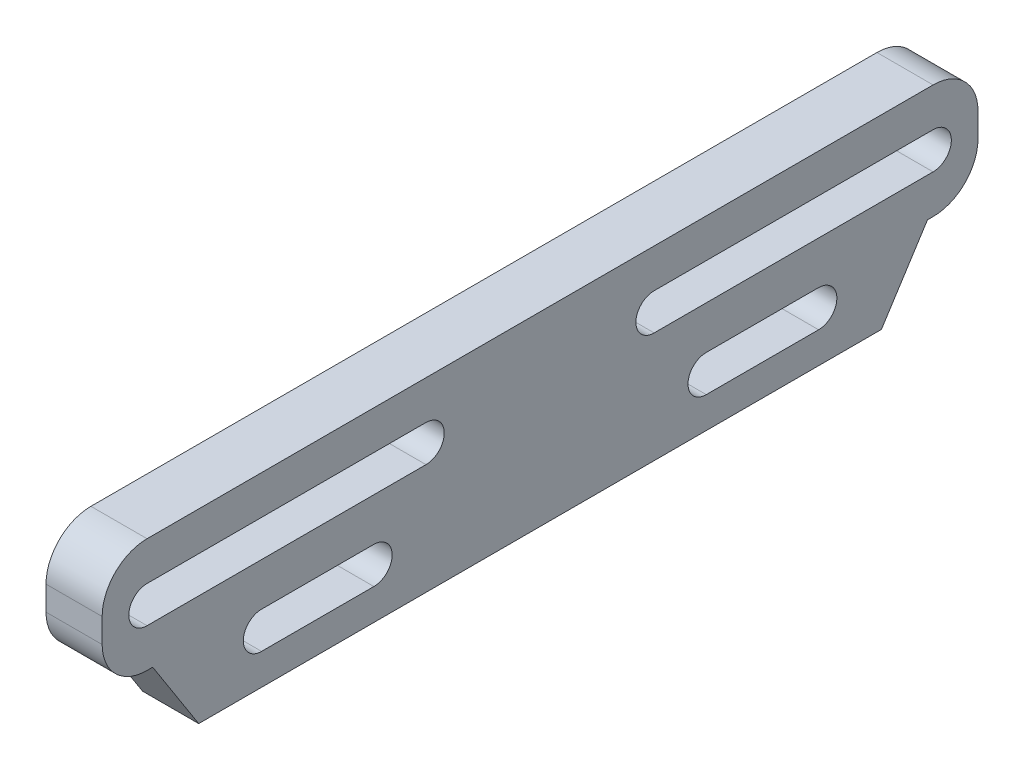
ISO-10303-21;
HEADER;
FILE_DESCRIPTION(('STEP AP214'),'2;1');
FILE_NAME('part.step','',(''),(''),'','','');
FILE_SCHEMA(('AUTOMOTIVE_DESIGN { 1 0 10303 214 1 1 1 1 }'));
ENDSEC;
DATA;
#1=APPLICATION_CONTEXT('core data for automotive mechanical design processes');
#2=APPLICATION_PROTOCOL_DEFINITION('international standard','automotive_design',2000,#1);
#3=PRODUCT_CONTEXT('',#1,'mechanical');
#4=PRODUCT('Part','Part','',(#3));
#5=PRODUCT_RELATED_PRODUCT_CATEGORY('part','',(#4));
#6=PRODUCT_DEFINITION_FORMATION('','',#4);
#7=PRODUCT_DEFINITION_CONTEXT('part definition',#1,'design');
#8=PRODUCT_DEFINITION('design','',#6,#7);
#9=PRODUCT_DEFINITION_SHAPE('','',#8);
#10=(LENGTH_UNIT() NAMED_UNIT(*) SI_UNIT(.MILLI.,.METRE.));
#11=(NAMED_UNIT(*) PLANE_ANGLE_UNIT() SI_UNIT($,.RADIAN.));
#12=(NAMED_UNIT(*) SI_UNIT($,.STERADIAN.) SOLID_ANGLE_UNIT());
#13=UNCERTAINTY_MEASURE_WITH_UNIT(LENGTH_MEASURE(1.E-05),#10,'distance_accuracy_value','');
#14=(GEOMETRIC_REPRESENTATION_CONTEXT(3) GLOBAL_UNCERTAINTY_ASSIGNED_CONTEXT((#13)) GLOBAL_UNIT_ASSIGNED_CONTEXT((#10,
#11,#12)) REPRESENTATION_CONTEXT('',''));
#15=CARTESIAN_POINT('',(0.,0.,0.));
#16=DIRECTION('',(0.,0.,1.));
#17=DIRECTION('',(1.,0.,0.));
#18=AXIS2_PLACEMENT_3D('',#15,#16,#17);
#19=CARTESIAN_POINT('',(0.,0.,-97.5));
#20=DIRECTION('',(-1.,0.,0.));
#21=DIRECTION('',(0.,0.,1.));
#22=AXIS2_PLACEMENT_3D('',#19,#20,#21);
#23=PLANE('',#22);
#24=CARTESIAN_POINT('',(0.,-5.,62.01));
#25=DIRECTION('',(1.,0.,0.));
#26=DIRECTION('',(0.,0.,-1.));
#27=AXIS2_PLACEMENT_3D('',#24,#25,#26);
#28=CIRCLE('',#27,4.065);
#29=CARTESIAN_POINT('',(0.,-0.935,62.01));
#30=VERTEX_POINT('',#29);
#31=CARTESIAN_POINT('',(0.,-9.065,62.01));
#32=VERTEX_POINT('',#31);
#33=EDGE_CURVE('E251',#30,#32,#28,.T.);
#34=ORIENTED_EDGE('',*,*,#33,.T.);
#35=DIRECTION('',(0.,0.,-1.));
#36=VECTOR('',#35,1.);
#37=CARTESIAN_POINT('',(0.,-9.065,62.01));
#38=LINE('',#37,#36);
#39=CARTESIAN_POINT('',(0.,-9.065,37.));
#40=VERTEX_POINT('',#39);
#41=EDGE_CURVE('E254',#32,#40,#38,.T.);
#42=ORIENTED_EDGE('',*,*,#41,.T.);
#43=CARTESIAN_POINT('',(0.,-5.,37.));
#44=DIRECTION('',(1.,0.,0.));
#45=DIRECTION('',(0.,0.,-1.));
#46=AXIS2_PLACEMENT_3D('',#43,#44,#45);
#47=CIRCLE('',#46,4.065);
#48=CARTESIAN_POINT('',(0.,-0.935,37.));
#49=VERTEX_POINT('',#48);
#50=EDGE_CURVE('E258',#40,#49,#47,.T.);
#51=ORIENTED_EDGE('',*,*,#50,.T.);
#52=DIRECTION('',(0.,0.,1.));
#53=VECTOR('',#52,1.);
#54=CARTESIAN_POINT('',(0.,-0.935,62.01));
#55=LINE('',#54,#53);
#56=EDGE_CURVE('E261',#49,#30,#55,.T.);
#57=ORIENTED_EDGE('',*,*,#56,.T.);
#58=EDGE_LOOP('',(#34,#42,#51,#57));
#59=FACE_BOUND('',#58,.T.);
#60=CARTESIAN_POINT('',(0.,12.7,25.4));
#61=DIRECTION('',(-1.,0.,0.));
#62=DIRECTION('',(0.,0.,1.));
#63=AXIS2_PLACEMENT_3D('',#60,#61,#62);
#64=CIRCLE('',#63,4.065);
#65=CARTESIAN_POINT('',(0.,16.765,25.4));
#66=VERTEX_POINT('',#65);
#67=CARTESIAN_POINT('',(0.,8.635,25.4));
#68=VERTEX_POINT('',#67);
#69=EDGE_CURVE('E334',#66,#68,#64,.T.);
#70=ORIENTED_EDGE('',*,*,#69,.F.);
#71=DIRECTION('',(0.,0.,-1.));
#72=VECTOR('',#71,1.);
#73=CARTESIAN_POINT('',(0.,16.765,25.4));
#74=LINE('',#73,#72);
#75=CARTESIAN_POINT('',(0.,16.765,87.5));
#76=VERTEX_POINT('',#75);
#77=EDGE_CURVE('E345',#76,#66,#74,.T.);
#78=ORIENTED_EDGE('',*,*,#77,.F.);
#79=CARTESIAN_POINT('',(0.,12.7,87.5));
#80=DIRECTION('',(-1.,0.,0.));
#81=DIRECTION('',(0.,0.,1.));
#82=AXIS2_PLACEMENT_3D('',#79,#80,#81);
#83=CIRCLE('',#82,4.065);
#84=CARTESIAN_POINT('',(0.,8.635,87.5));
#85=VERTEX_POINT('',#84);
#86=EDGE_CURVE('E359',#85,#76,#83,.T.);
#87=ORIENTED_EDGE('',*,*,#86,.F.);
#88=DIRECTION('',(0.,0.,1.));
#89=VECTOR('',#88,1.);
#90=CARTESIAN_POINT('',(0.,8.635,25.4));
#91=LINE('',#90,#89);
#92=EDGE_CURVE('E356',#68,#85,#91,.T.);
#93=ORIENTED_EDGE('',*,*,#92,.F.);
#94=EDGE_LOOP('',(#70,#78,#87,#93));
#95=FACE_BOUND('',#94,.T.);
#96=DIRECTION('',(0.,-1.,0.));
#97=VECTOR('',#96,1.);
#98=CARTESIAN_POINT('',(0.,0.,97.5));
#99=LINE('',#98,#97);
#100=CARTESIAN_POINT('',(0.,15.4,97.5));
#101=VERTEX_POINT('',#100);
#102=CARTESIAN_POINT('',(0.,10.,97.5));
#103=VERTEX_POINT('',#102);
#104=EDGE_CURVE('E366',#101,#103,#99,.T.);
#105=ORIENTED_EDGE('',*,*,#104,.F.);
#106=CARTESIAN_POINT('',(0.,15.4,87.5));
#107=DIRECTION('',(-1.,0.,0.));
#108=DIRECTION('',(0.,0.,1.));
#109=AXIS2_PLACEMENT_3D('',#106,#107,#108);
#110=CIRCLE('',#109,10.);
#111=CARTESIAN_POINT('',(0.,25.4,87.5));
#112=VERTEX_POINT('',#111);
#113=EDGE_CURVE('E41',#101,#112,#110,.T.);
#114=ORIENTED_EDGE('',*,*,#113,.T.);
#115=DIRECTION('',(0.,0.,1.));
#116=VECTOR('',#115,1.);
#117=CARTESIAN_POINT('',(0.,25.4,-97.5));
#118=LINE('',#117,#116);
#119=CARTESIAN_POINT('',(0.,25.4,-87.5));
#120=VERTEX_POINT('',#119);
#121=EDGE_CURVE('E383',#120,#112,#118,.T.);
#122=ORIENTED_EDGE('',*,*,#121,.F.);
#123=CARTESIAN_POINT('',(0.,15.4,-87.5));
#124=DIRECTION('',(-1.,0.,0.));
#125=DIRECTION('',(0.,0.,1.));
#126=AXIS2_PLACEMENT_3D('',#123,#124,#125);
#127=CIRCLE('',#126,10.);
#128=CARTESIAN_POINT('',(0.,15.4,-97.5));
#129=VERTEX_POINT('',#128);
#130=EDGE_CURVE('E411',#120,#129,#127,.T.);
#131=ORIENTED_EDGE('',*,*,#130,.T.);
#132=DIRECTION('',(0.,-1.,0.));
#133=VECTOR('',#132,1.);
#134=CARTESIAN_POINT('',(0.,0.,-97.5));
#135=LINE('',#134,#133);
#136=CARTESIAN_POINT('',(0.,10.,-97.5));
#137=VERTEX_POINT('',#136);
#138=EDGE_CURVE('E377',#129,#137,#135,.T.);
#139=ORIENTED_EDGE('',*,*,#138,.T.);
#140=CARTESIAN_POINT('',(0.,10.,-87.5));
#141=DIRECTION('',(-1.,0.,0.));
#142=DIRECTION('',(0.,0.,1.));
#143=AXIS2_PLACEMENT_3D('',#140,#141,#142);
#144=CIRCLE('',#143,10.);
#145=CARTESIAN_POINT('',(0.,0.,-87.5));
#146=VERTEX_POINT('',#145);
#147=EDGE_CURVE('E403',#137,#146,#144,.T.);
#148=ORIENTED_EDGE('',*,*,#147,.T.);
#149=DIRECTION('',(0.,0.,1.));
#150=VECTOR('',#149,1.);
#151=CARTESIAN_POINT('',(0.,0.,-97.5));
#152=LINE('',#151,#150);
#153=CARTESIAN_POINT('',(0.,0.,-86.2469507659596));
#154=VERTEX_POINT('',#153);
#155=EDGE_CURVE('E393',#146,#154,#152,.T.);
#156=ORIENTED_EDGE('',*,*,#155,.T.);
#157=DIRECTION('',(0.,0.842105263157895,-0.5393131982084));
#158=VECTOR('',#157,1.);
#159=CARTESIAN_POINT('',(0.,-16.,-76.));
#160=LINE('',#159,#158);
#161=CARTESIAN_POINT('',(0.,-16.,-76.));
#162=VERTEX_POINT('',#161);
#163=EDGE_CURVE('E295',#162,#154,#160,.T.);
#164=ORIENTED_EDGE('',*,*,#163,.F.);
#165=DIRECTION('',(0.,0.,-1.));
#166=VECTOR('',#165,1.);
#167=CARTESIAN_POINT('',(0.,-16.,0.));
#168=LINE('',#167,#166);
#169=CARTESIAN_POINT('',(0.,-16.,76.));
#170=VERTEX_POINT('',#169);
#171=EDGE_CURVE('E300',#170,#162,#168,.T.);
#172=ORIENTED_EDGE('',*,*,#171,.F.);
#173=DIRECTION('',(0.,-0.842105263157895,-0.5393131982084));
#174=VECTOR('',#173,1.);
#175=CARTESIAN_POINT('',(0.,-16.,76.));
#176=LINE('',#175,#174);
#177=CARTESIAN_POINT('',(0.,0.,86.2469507659596));
#178=VERTEX_POINT('',#177);
#179=EDGE_CURVE('E286',#178,#170,#176,.T.);
#180=ORIENTED_EDGE('',*,*,#179,.F.);
#181=CARTESIAN_POINT('',(0.,0.,87.5));
#182=VERTEX_POINT('',#181);
#183=EDGE_CURVE('E382',#178,#182,#152,.T.);
#184=ORIENTED_EDGE('',*,*,#183,.T.);
#185=CARTESIAN_POINT('',(0.,10.,87.5));
#186=DIRECTION('',(-1.,0.,0.));
#187=DIRECTION('',(0.,0.,1.));
#188=AXIS2_PLACEMENT_3D('',#185,#186,#187);
#189=CIRCLE('',#188,10.);
#190=EDGE_CURVE('E421',#182,#103,#189,.T.);
#191=ORIENTED_EDGE('',*,*,#190,.T.);
#192=EDGE_LOOP('',(#105,#114,#122,#131,#139,#148,#156,#164,#172,#180,#184,#191));
#193=FACE_BOUND('',#192,.T.);
#194=DIRECTION('',(0.,0.,1.));
#195=VECTOR('',#194,1.);
#196=CARTESIAN_POINT('',(0.,16.765,-25.4));
#197=LINE('',#196,#195);
#198=CARTESIAN_POINT('',(0.,16.765,-87.5));
#199=VERTEX_POINT('',#198);
#200=CARTESIAN_POINT('',(0.,16.765,-25.4));
#201=VERTEX_POINT('',#200);
#202=EDGE_CURVE('E323',#199,#201,#197,.T.);
#203=ORIENTED_EDGE('',*,*,#202,.T.);
#204=CARTESIAN_POINT('',(0.,12.7,-25.4));
#205=DIRECTION('',(1.,0.,0.));
#206=DIRECTION('',(0.,0.,-1.));
#207=AXIS2_PLACEMENT_3D('',#204,#205,#206);
#208=CIRCLE('',#207,4.065);
#209=CARTESIAN_POINT('',(0.,8.635,-25.4));
#210=VERTEX_POINT('',#209);
#211=EDGE_CURVE('E309',#201,#210,#208,.T.);
#212=ORIENTED_EDGE('',*,*,#211,.T.);
#213=DIRECTION('',(0.,0.,-1.));
#214=VECTOR('',#213,1.);
#215=CARTESIAN_POINT('',(0.,8.635,-25.4));
#216=LINE('',#215,#214);
#217=CARTESIAN_POINT('',(0.,8.635,-87.5));
#218=VERTEX_POINT('',#217);
#219=EDGE_CURVE('E313',#210,#218,#216,.T.);
#220=ORIENTED_EDGE('',*,*,#219,.T.);
#221=CARTESIAN_POINT('',(0.,12.7,-87.5));
#222=DIRECTION('',(1.,0.,0.));
#223=DIRECTION('',(0.,0.,-1.));
#224=AXIS2_PLACEMENT_3D('',#221,#222,#223);
#225=CIRCLE('',#224,4.065);
#226=EDGE_CURVE('E326',#218,#199,#225,.T.);
#227=ORIENTED_EDGE('',*,*,#226,.T.);
#228=EDGE_LOOP('',(#203,#212,#220,#227));
#229=FACE_BOUND('',#228,.T.);
#230=DIRECTION('',(0.,0.,1.));
#231=VECTOR('',#230,1.);
#232=CARTESIAN_POINT('',(0.,-9.065,-62.01));
#233=LINE('',#232,#231);
#234=CARTESIAN_POINT('',(0.,-9.065,-62.01));
#235=VERTEX_POINT('',#234);
#236=CARTESIAN_POINT('',(0.,-9.065,-37.));
#237=VERTEX_POINT('',#236);
#238=EDGE_CURVE('E229',#235,#237,#233,.T.);
#239=ORIENTED_EDGE('',*,*,#238,.F.);
#240=CARTESIAN_POINT('',(0.,-5.,-62.01));
#241=DIRECTION('',(-1.,0.,0.));
#242=DIRECTION('',(0.,0.,1.));
#243=AXIS2_PLACEMENT_3D('',#240,#241,#242);
#244=CIRCLE('',#243,4.065);
#245=CARTESIAN_POINT('',(0.,-0.935,-62.01));
#246=VERTEX_POINT('',#245);
#247=EDGE_CURVE('E225',#246,#235,#244,.T.);
#248=ORIENTED_EDGE('',*,*,#247,.F.);
#249=DIRECTION('',(0.,0.,-1.));
#250=VECTOR('',#249,1.);
#251=CARTESIAN_POINT('',(0.,-0.935,-62.01));
#252=LINE('',#251,#250);
#253=CARTESIAN_POINT('',(0.,-0.935,-37.));
#254=VERTEX_POINT('',#253);
#255=EDGE_CURVE('E217',#254,#246,#252,.T.);
#256=ORIENTED_EDGE('',*,*,#255,.F.);
#257=CARTESIAN_POINT('',(0.,-5.,-37.));
#258=DIRECTION('',(-1.,0.,0.));
#259=DIRECTION('',(0.,0.,1.));
#260=AXIS2_PLACEMENT_3D('',#257,#258,#259);
#261=CIRCLE('',#260,4.065);
#262=EDGE_CURVE('E224',#237,#254,#261,.T.);
#263=ORIENTED_EDGE('',*,*,#262,.F.);
#264=EDGE_LOOP('',(#239,#248,#256,#263));
#265=FACE_BOUND('',#264,.T.);
#266=ADVANCED_FACE('F33',(#59,#95,#193,#229,#265),#23,.T.);
#267=CARTESIAN_POINT('',(12.5,0.,-97.5));
#268=DIRECTION('',(1.,0.,0.));
#269=DIRECTION('',(0.,0.,-1.));
#270=AXIS2_PLACEMENT_3D('',#267,#268,#269);
#271=PLANE('',#270);
#272=CARTESIAN_POINT('',(12.5,-5.,62.01));
#273=DIRECTION('',(1.,0.,0.));
#274=DIRECTION('',(0.,0.,-1.));
#275=AXIS2_PLACEMENT_3D('',#272,#273,#274);
#276=CIRCLE('',#275,4.065);
#277=CARTESIAN_POINT('',(12.5,-0.935,62.01));
#278=VERTEX_POINT('',#277);
#279=CARTESIAN_POINT('',(12.5,-9.065,62.01));
#280=VERTEX_POINT('',#279);
#281=EDGE_CURVE('E247',#278,#280,#276,.T.);
#282=ORIENTED_EDGE('',*,*,#281,.F.);
#283=DIRECTION('',(0.,0.,1.));
#284=VECTOR('',#283,1.);
#285=CARTESIAN_POINT('',(12.5,-0.935,62.01));
#286=LINE('',#285,#284);
#287=CARTESIAN_POINT('',(12.5,-0.935,37.));
#288=VERTEX_POINT('',#287);
#289=EDGE_CURVE('E255',#288,#278,#286,.T.);
#290=ORIENTED_EDGE('',*,*,#289,.F.);
#291=CARTESIAN_POINT('',(12.5,-5.,37.));
#292=DIRECTION('',(1.,0.,0.));
#293=DIRECTION('',(0.,0.,-1.));
#294=AXIS2_PLACEMENT_3D('',#291,#292,#293);
#295=CIRCLE('',#294,4.065);
#296=CARTESIAN_POINT('',(12.5,-9.065,37.));
#297=VERTEX_POINT('',#296);
#298=EDGE_CURVE('E269',#297,#288,#295,.T.);
#299=ORIENTED_EDGE('',*,*,#298,.F.);
#300=DIRECTION('',(0.,0.,-1.));
#301=VECTOR('',#300,1.);
#302=CARTESIAN_POINT('',(12.5,-9.065,62.01));
#303=LINE('',#302,#301);
#304=EDGE_CURVE('E266',#280,#297,#303,.T.);
#305=ORIENTED_EDGE('',*,*,#304,.F.);
#306=EDGE_LOOP('',(#282,#290,#299,#305));
#307=FACE_BOUND('',#306,.T.);
#308=CARTESIAN_POINT('',(12.5,12.7,25.4));
#309=DIRECTION('',(-1.,0.,0.));
#310=DIRECTION('',(0.,0.,1.));
#311=AXIS2_PLACEMENT_3D('',#308,#309,#310);
#312=CIRCLE('',#311,4.065);
#313=CARTESIAN_POINT('',(12.5,16.765,25.4));
#314=VERTEX_POINT('',#313);
#315=CARTESIAN_POINT('',(12.5,8.635,25.4));
#316=VERTEX_POINT('',#315);
#317=EDGE_CURVE('E341',#314,#316,#312,.T.);
#318=ORIENTED_EDGE('',*,*,#317,.T.);
#319=DIRECTION('',(0.,0.,1.));
#320=VECTOR('',#319,1.);
#321=CARTESIAN_POINT('',(12.5,8.635,25.4));
#322=LINE('',#321,#320);
#323=CARTESIAN_POINT('',(12.5,8.635,87.5));
#324=VERTEX_POINT('',#323);
#325=EDGE_CURVE('E344',#316,#324,#322,.T.);
#326=ORIENTED_EDGE('',*,*,#325,.T.);
#327=CARTESIAN_POINT('',(12.5,12.7,87.5));
#328=DIRECTION('',(-1.,0.,0.));
#329=DIRECTION('',(0.,0.,1.));
#330=AXIS2_PLACEMENT_3D('',#327,#328,#329);
#331=CIRCLE('',#330,4.065);
#332=CARTESIAN_POINT('',(12.5,16.765,87.5));
#333=VERTEX_POINT('',#332);
#334=EDGE_CURVE('E348',#324,#333,#331,.T.);
#335=ORIENTED_EDGE('',*,*,#334,.T.);
#336=DIRECTION('',(0.,0.,-1.));
#337=VECTOR('',#336,1.);
#338=CARTESIAN_POINT('',(12.5,16.765,25.4));
#339=LINE('',#338,#337);
#340=EDGE_CURVE('E351',#333,#314,#339,.T.);
#341=ORIENTED_EDGE('',*,*,#340,.T.);
#342=EDGE_LOOP('',(#318,#326,#335,#341));
#343=FACE_BOUND('',#342,.T.);
#344=DIRECTION('',(0.,0.,1.));
#345=VECTOR('',#344,1.);
#346=CARTESIAN_POINT('',(12.5,25.4,-97.5));
#347=LINE('',#346,#345);
#348=CARTESIAN_POINT('',(12.5,25.4,-87.5));
#349=VERTEX_POINT('',#348);
#350=CARTESIAN_POINT('',(12.5,25.4,87.5));
#351=VERTEX_POINT('',#350);
#352=EDGE_CURVE('E387',#349,#351,#347,.T.);
#353=ORIENTED_EDGE('',*,*,#352,.T.);
#354=CARTESIAN_POINT('',(12.5,15.4,87.5));
#355=DIRECTION('',(1.,0.,0.));
#356=DIRECTION('',(0.,0.,-1.));
#357=AXIS2_PLACEMENT_3D('',#354,#355,#356);
#358=CIRCLE('',#357,10.);
#359=CARTESIAN_POINT('',(12.5,15.4,97.5));
#360=VERTEX_POINT('',#359);
#361=EDGE_CURVE('E11',#351,#360,#358,.T.);
#362=ORIENTED_EDGE('',*,*,#361,.T.);
#363=DIRECTION('',(0.,1.,0.));
#364=VECTOR('',#363,1.);
#365=CARTESIAN_POINT('',(12.5,0.,97.5));
#366=LINE('',#365,#364);
#367=CARTESIAN_POINT('',(12.5,10.,97.5));
#368=VERTEX_POINT('',#367);
#369=EDGE_CURVE('E374',#368,#360,#366,.T.);
#370=ORIENTED_EDGE('',*,*,#369,.F.);
#371=CARTESIAN_POINT('',(12.5,10.,87.5));
#372=DIRECTION('',(1.,0.,0.));
#373=DIRECTION('',(0.,0.,-1.));
#374=AXIS2_PLACEMENT_3D('',#371,#372,#373);
#375=CIRCLE('',#374,10.);
#376=CARTESIAN_POINT('',(12.5,0.,87.5));
#377=VERTEX_POINT('',#376);
#378=EDGE_CURVE('E424',#368,#377,#375,.T.);
#379=ORIENTED_EDGE('',*,*,#378,.T.);
#380=DIRECTION('',(0.,0.,1.));
#381=VECTOR('',#380,1.);
#382=CARTESIAN_POINT('',(12.5,0.,-97.5));
#383=LINE('',#382,#381);
#384=CARTESIAN_POINT('',(12.5,0.,86.2469507659596));
#385=VERTEX_POINT('',#384);
#386=EDGE_CURVE('E392',#385,#377,#383,.T.);
#387=ORIENTED_EDGE('',*,*,#386,.F.);
#388=DIRECTION('',(0.,-0.842105263157895,-0.5393131982084));
#389=VECTOR('',#388,1.);
#390=CARTESIAN_POINT('',(12.5,-16.,76.));
#391=LINE('',#390,#389);
#392=CARTESIAN_POINT('',(12.5,-16.,76.));
#393=VERTEX_POINT('',#392);
#394=EDGE_CURVE('E276',#385,#393,#391,.T.);
#395=ORIENTED_EDGE('',*,*,#394,.T.);
#396=DIRECTION('',(0.,0.,-1.));
#397=VECTOR('',#396,1.);
#398=CARTESIAN_POINT('',(12.5,-16.,0.));
#399=LINE('',#398,#397);
#400=CARTESIAN_POINT('',(12.5,-16.,-76.));
#401=VERTEX_POINT('',#400);
#402=EDGE_CURVE('E287',#393,#401,#399,.T.);
#403=ORIENTED_EDGE('',*,*,#402,.T.);
#404=DIRECTION('',(0.,0.842105263157895,-0.5393131982084));
#405=VECTOR('',#404,1.);
#406=CARTESIAN_POINT('',(12.5,-16.,-76.));
#407=LINE('',#406,#405);
#408=CARTESIAN_POINT('',(12.5,0.,-86.2469507659596));
#409=VERTEX_POINT('',#408);
#410=EDGE_CURVE('E283',#401,#409,#407,.T.);
#411=ORIENTED_EDGE('',*,*,#410,.T.);
#412=CARTESIAN_POINT('',(12.5,0.,-87.5));
#413=VERTEX_POINT('',#412);
#414=EDGE_CURVE('E390',#413,#409,#383,.T.);
#415=ORIENTED_EDGE('',*,*,#414,.F.);
#416=CARTESIAN_POINT('',(12.5,10.,-87.5));
#417=DIRECTION('',(1.,0.,0.));
#418=DIRECTION('',(0.,0.,-1.));
#419=AXIS2_PLACEMENT_3D('',#416,#417,#418);
#420=CIRCLE('',#419,10.);
#421=CARTESIAN_POINT('',(12.5,10.,-97.5));
#422=VERTEX_POINT('',#421);
#423=EDGE_CURVE('E401',#413,#422,#420,.T.);
#424=ORIENTED_EDGE('',*,*,#423,.T.);
#425=DIRECTION('',(0.,1.,0.));
#426=VECTOR('',#425,1.);
#427=CARTESIAN_POINT('',(12.5,0.,-97.5));
#428=LINE('',#427,#426);
#429=CARTESIAN_POINT('',(12.5,15.4,-97.5));
#430=VERTEX_POINT('',#429);
#431=EDGE_CURVE('E379',#422,#430,#428,.T.);
#432=ORIENTED_EDGE('',*,*,#431,.T.);
#433=CARTESIAN_POINT('',(12.5,15.4,-87.5));
#434=DIRECTION('',(1.,0.,0.));
#435=DIRECTION('',(0.,0.,-1.));
#436=AXIS2_PLACEMENT_3D('',#433,#434,#435);
#437=CIRCLE('',#436,10.);
#438=EDGE_CURVE('E413',#430,#349,#437,.T.);
#439=ORIENTED_EDGE('',*,*,#438,.T.);
#440=EDGE_LOOP('',(#353,#362,#370,#379,#387,#395,#403,#411,#415,#424,#432,#439));
#441=FACE_BOUND('',#440,.T.);
#442=DIRECTION('',(0.,0.,-1.));
#443=VECTOR('',#442,1.);
#444=CARTESIAN_POINT('',(12.5,8.635,-25.4));
#445=LINE('',#444,#443);
#446=CARTESIAN_POINT('',(12.5,8.635,-25.4));
#447=VERTEX_POINT('',#446);
#448=CARTESIAN_POINT('',(12.5,8.635,-87.5));
#449=VERTEX_POINT('',#448);
#450=EDGE_CURVE('E318',#447,#449,#445,.T.);
#451=ORIENTED_EDGE('',*,*,#450,.F.);
#452=CARTESIAN_POINT('',(12.5,12.7,-25.4));
#453=DIRECTION('',(1.,0.,0.));
#454=DIRECTION('',(0.,0.,-1.));
#455=AXIS2_PLACEMENT_3D('',#452,#453,#454);
#456=CIRCLE('',#455,4.065);
#457=CARTESIAN_POINT('',(12.5,16.765,-25.4));
#458=VERTEX_POINT('',#457);
#459=EDGE_CURVE('E310',#458,#447,#456,.T.);
#460=ORIENTED_EDGE('',*,*,#459,.F.);
#461=DIRECTION('',(0.,0.,1.));
#462=VECTOR('',#461,1.);
#463=CARTESIAN_POINT('',(12.5,16.765,-25.4));
#464=LINE('',#463,#462);
#465=CARTESIAN_POINT('',(12.5,16.765,-87.5));
#466=VERTEX_POINT('',#465);
#467=EDGE_CURVE('E312',#466,#458,#464,.T.);
#468=ORIENTED_EDGE('',*,*,#467,.F.);
#469=CARTESIAN_POINT('',(12.5,12.7,-87.5));
#470=DIRECTION('',(1.,0.,0.));
#471=DIRECTION('',(0.,0.,-1.));
#472=AXIS2_PLACEMENT_3D('',#469,#470,#471);
#473=CIRCLE('',#472,4.065);
#474=EDGE_CURVE('E315',#449,#466,#473,.T.);
#475=ORIENTED_EDGE('',*,*,#474,.F.);
#476=EDGE_LOOP('',(#451,#460,#468,#475));
#477=FACE_BOUND('',#476,.T.);
#478=DIRECTION('',(0.,0.,-1.));
#479=VECTOR('',#478,1.);
#480=CARTESIAN_POINT('',(12.5,-0.935,-62.01));
#481=LINE('',#480,#479);
#482=CARTESIAN_POINT('',(12.5,-0.935,-37.));
#483=VERTEX_POINT('',#482);
#484=CARTESIAN_POINT('',(12.5,-0.935,-62.01));
#485=VERTEX_POINT('',#484);
#486=EDGE_CURVE('E241',#483,#485,#481,.T.);
#487=ORIENTED_EDGE('',*,*,#486,.T.);
#488=CARTESIAN_POINT('',(12.5,-5.,-62.01));
#489=DIRECTION('',(-1.,0.,0.));
#490=DIRECTION('',(0.,0.,1.));
#491=AXIS2_PLACEMENT_3D('',#488,#489,#490);
#492=CIRCLE('',#491,4.065);
#493=CARTESIAN_POINT('',(12.5,-9.065,-62.01));
#494=VERTEX_POINT('',#493);
#495=EDGE_CURVE('E56',#485,#494,#492,.T.);
#496=ORIENTED_EDGE('',*,*,#495,.T.);
#497=DIRECTION('',(0.,0.,1.));
#498=VECTOR('',#497,1.);
#499=CARTESIAN_POINT('',(12.5,-9.065,-62.01));
#500=LINE('',#499,#498);
#501=CARTESIAN_POINT('',(12.5,-9.065,-37.));
#502=VERTEX_POINT('',#501);
#503=EDGE_CURVE('E232',#494,#502,#500,.T.);
#504=ORIENTED_EDGE('',*,*,#503,.T.);
#505=CARTESIAN_POINT('',(12.5,-5.,-37.));
#506=DIRECTION('',(-1.,0.,0.));
#507=DIRECTION('',(0.,0.,1.));
#508=AXIS2_PLACEMENT_3D('',#505,#506,#507);
#509=CIRCLE('',#508,4.065);
#510=EDGE_CURVE('E235',#502,#483,#509,.T.);
#511=ORIENTED_EDGE('',*,*,#510,.T.);
#512=EDGE_LOOP('',(#487,#496,#504,#511));
#513=FACE_BOUND('',#512,.T.);
#514=ADVANCED_FACE('F457',(#307,#343,#441,#477,#513),#271,.T.);
#515=CARTESIAN_POINT('',(0.,0.,-97.5));
#516=DIRECTION('',(0.,-1.,0.));
#517=DIRECTION('',(0.,0.,-1.));
#518=AXIS2_PLACEMENT_3D('',#515,#516,#517);
#519=PLANE('',#518);
#520=DIRECTION('',(1.,0.,0.));
#521=VECTOR('',#520,1.);
#522=CARTESIAN_POINT('',(-173.234367449717,0.,86.2469507659596));
#523=LINE('',#522,#521);
#524=EDGE_CURVE('E305',#178,#385,#523,.T.);
#525=ORIENTED_EDGE('',*,*,#524,.T.);
#526=ORIENTED_EDGE('',*,*,#386,.T.);
#527=DIRECTION('',(1.,0.,0.));
#528=VECTOR('',#527,1.);
#529=CARTESIAN_POINT('',(0.,0.,87.5));
#530=LINE('',#529,#528);
#531=EDGE_CURVE('E418',#377,#182,#530,.F.);
#532=ORIENTED_EDGE('',*,*,#531,.T.);
#533=ORIENTED_EDGE('',*,*,#183,.F.);
#534=EDGE_LOOP('',(#525,#526,#532,#533));
#535=FACE_BOUND('',#534,.T.);
#536=ADVANCED_FACE('F478',(#535),#519,.T.);
#537=CARTESIAN_POINT('',(0.,15.4,87.5));
#538=DIRECTION('',(-1.,0.,0.));
#539=DIRECTION('',(0.,0.,1.));
#540=AXIS2_PLACEMENT_3D('',#537,#538,#539);
#541=CYLINDRICAL_SURFACE('',#540,10.);
#542=DIRECTION('',(1.,0.,0.));
#543=VECTOR('',#542,1.);
#544=CARTESIAN_POINT('',(0.,25.4,87.5));
#545=LINE('',#544,#543);
#546=EDGE_CURVE('E427',#112,#351,#545,.T.);
#547=ORIENTED_EDGE('',*,*,#546,.F.);
#548=ORIENTED_EDGE('',*,*,#113,.F.);
#549=DIRECTION('',(1.,0.,0.));
#550=VECTOR('',#549,1.);
#551=CARTESIAN_POINT('',(0.,15.4,97.5));
#552=LINE('',#551,#550);
#553=EDGE_CURVE('E430',#360,#101,#552,.F.);
#554=ORIENTED_EDGE('',*,*,#553,.F.);
#555=ORIENTED_EDGE('',*,*,#361,.F.);
#556=EDGE_LOOP('',(#547,#548,#554,#555));
#557=FACE_BOUND('',#556,.T.);
#558=ADVANCED_FACE('F35',(#557),#541,.T.);
#559=CARTESIAN_POINT('',(0.,10.,87.5));
#560=DIRECTION('',(-1.,0.,0.));
#561=DIRECTION('',(0.,0.,1.));
#562=AXIS2_PLACEMENT_3D('',#559,#560,#561);
#563=CYLINDRICAL_SURFACE('',#562,10.);
#564=DIRECTION('',(1.,0.,0.));
#565=VECTOR('',#564,1.);
#566=CARTESIAN_POINT('',(0.,10.,97.5));
#567=LINE('',#566,#565);
#568=EDGE_CURVE('E415',#103,#368,#567,.T.);
#569=ORIENTED_EDGE('',*,*,#568,.F.);
#570=ORIENTED_EDGE('',*,*,#190,.F.);
#571=ORIENTED_EDGE('',*,*,#531,.F.);
#572=ORIENTED_EDGE('',*,*,#378,.F.);
#573=EDGE_LOOP('',(#569,#570,#571,#572));
#574=FACE_BOUND('',#573,.T.);
#575=ADVANCED_FACE('F483',(#574),#563,.T.);
#576=CARTESIAN_POINT('',(0.,15.4,-87.5));
#577=DIRECTION('',(1.,0.,0.));
#578=DIRECTION('',(0.,0.,-1.));
#579=AXIS2_PLACEMENT_3D('',#576,#577,#578);
#580=CYLINDRICAL_SURFACE('',#579,10.);
#581=DIRECTION('',(1.,0.,0.));
#582=VECTOR('',#581,1.);
#583=CARTESIAN_POINT('',(0.,15.4,-97.5));
#584=LINE('',#583,#582);
#585=EDGE_CURVE('E405',#129,#430,#584,.T.);
#586=ORIENTED_EDGE('',*,*,#585,.F.);
#587=ORIENTED_EDGE('',*,*,#130,.F.);
#588=DIRECTION('',(1.,0.,0.));
#589=VECTOR('',#588,1.);
#590=CARTESIAN_POINT('',(0.,25.4,-87.5));
#591=LINE('',#590,#589);
#592=EDGE_CURVE('E408',#349,#120,#591,.F.);
#593=ORIENTED_EDGE('',*,*,#592,.F.);
#594=ORIENTED_EDGE('',*,*,#438,.F.);
#595=EDGE_LOOP('',(#586,#587,#593,#594));
#596=FACE_BOUND('',#595,.T.);
#597=ADVANCED_FACE('F445',(#596),#580,.T.);
#598=CARTESIAN_POINT('',(0.,10.,-87.5));
#599=DIRECTION('',(-1.,0.,0.));
#600=DIRECTION('',(0.,0.,1.));
#601=AXIS2_PLACEMENT_3D('',#598,#599,#600);
#602=CYLINDRICAL_SURFACE('',#601,10.);
#603=DIRECTION('',(-1.,0.,0.));
#604=VECTOR('',#603,1.);
#605=CARTESIAN_POINT('',(0.,10.,-97.5));
#606=LINE('',#605,#604);
#607=EDGE_CURVE('E386',#422,#137,#606,.T.);
#608=ORIENTED_EDGE('',*,*,#607,.F.);
#609=ORIENTED_EDGE('',*,*,#423,.F.);
#610=DIRECTION('',(-1.,0.,0.));
#611=VECTOR('',#610,1.);
#612=CARTESIAN_POINT('',(0.,0.,-87.5));
#613=LINE('',#612,#611);
#614=EDGE_CURVE('E398',#146,#413,#613,.F.);
#615=ORIENTED_EDGE('',*,*,#614,.F.);
#616=ORIENTED_EDGE('',*,*,#147,.F.);
#617=EDGE_LOOP('',(#608,#609,#615,#616));
#618=FACE_BOUND('',#617,.T.);
#619=ADVANCED_FACE('F452',(#618),#602,.T.);
#620=CARTESIAN_POINT('',(0.,25.4,-97.5));
#621=DIRECTION('',(0.,1.,0.));
#622=DIRECTION('',(0.,0.,1.));
#623=AXIS2_PLACEMENT_3D('',#620,#621,#622);
#624=PLANE('',#623);
#625=ORIENTED_EDGE('',*,*,#121,.T.);
#626=ORIENTED_EDGE('',*,*,#546,.T.);
#627=ORIENTED_EDGE('',*,*,#352,.F.);
#628=ORIENTED_EDGE('',*,*,#592,.T.);
#629=EDGE_LOOP('',(#625,#626,#627,#628));
#630=FACE_BOUND('',#629,.T.);
#631=ADVANCED_FACE('F441',(#630),#624,.T.);
#632=DIRECTION('',(1.,0.,0.));
#633=VECTOR('',#632,1.);
#634=CARTESIAN_POINT('',(-173.234367449717,0.,-86.2469507659596));
#635=LINE('',#634,#633);
#636=EDGE_CURVE('E298',#154,#409,#635,.T.);
#637=ORIENTED_EDGE('',*,*,#636,.F.);
#638=ORIENTED_EDGE('',*,*,#155,.F.);
#639=ORIENTED_EDGE('',*,*,#614,.T.);
#640=ORIENTED_EDGE('',*,*,#414,.T.);
#641=EDGE_LOOP('',(#637,#638,#639,#640));
#642=FACE_BOUND('',#641,.T.);
#643=ADVANCED_FACE('F461',(#642),#519,.T.);
#644=CARTESIAN_POINT('',(0.,0.,-97.5));
#645=DIRECTION('',(0.,0.,-1.));
#646=DIRECTION('',(-1.,0.,0.));
#647=AXIS2_PLACEMENT_3D('',#644,#645,#646);
#648=PLANE('',#647);
#649=ORIENTED_EDGE('',*,*,#138,.F.);
#650=ORIENTED_EDGE('',*,*,#585,.T.);
#651=ORIENTED_EDGE('',*,*,#431,.F.);
#652=ORIENTED_EDGE('',*,*,#607,.T.);
#653=EDGE_LOOP('',(#649,#650,#651,#652));
#654=FACE_BOUND('',#653,.T.);
#655=ADVANCED_FACE('F455',(#654),#648,.T.);
#656=CARTESIAN_POINT('',(0.,0.,97.5));
#657=DIRECTION('',(0.,0.,-1.));
#658=DIRECTION('',(-1.,0.,0.));
#659=AXIS2_PLACEMENT_3D('',#656,#657,#658);
#660=PLANE('',#659);
#661=ORIENTED_EDGE('',*,*,#369,.T.);
#662=ORIENTED_EDGE('',*,*,#553,.T.);
#663=ORIENTED_EDGE('',*,*,#104,.T.);
#664=ORIENTED_EDGE('',*,*,#568,.T.);
#665=EDGE_LOOP('',(#661,#662,#663,#664));
#666=FACE_BOUND('',#665,.T.);
#667=ADVANCED_FACE('F485',(#666),#660,.F.);
#668=CARTESIAN_POINT('',(12.5,12.7,25.4));
#669=DIRECTION('',(-1.,0.,0.));
#670=DIRECTION('',(0.,0.,1.));
#671=AXIS2_PLACEMENT_3D('',#668,#669,#670);
#672=CYLINDRICAL_SURFACE('',#671,4.065);
#673=ORIENTED_EDGE('',*,*,#69,.T.);
#674=DIRECTION('',(-1.,0.,0.));
#675=VECTOR('',#674,1.);
#676=CARTESIAN_POINT('',(12.5,8.635,25.4));
#677=LINE('',#676,#675);
#678=EDGE_CURVE('E354',#316,#68,#677,.T.);
#679=ORIENTED_EDGE('',*,*,#678,.F.);
#680=ORIENTED_EDGE('',*,*,#317,.F.);
#681=DIRECTION('',(-1.,0.,0.));
#682=VECTOR('',#681,1.);
#683=CARTESIAN_POINT('',(12.5,16.765,25.4));
#684=LINE('',#683,#682);
#685=EDGE_CURVE('E364',#314,#66,#684,.T.);
#686=ORIENTED_EDGE('',*,*,#685,.T.);
#687=EDGE_LOOP('',(#673,#679,#680,#686));
#688=FACE_BOUND('',#687,.T.);
#689=ADVANCED_FACE('F487',(#688),#672,.F.);
#690=CARTESIAN_POINT('',(12.5,16.765,25.4));
#691=DIRECTION('',(0.,1.,0.));
#692=DIRECTION('',(0.,0.,1.));
#693=AXIS2_PLACEMENT_3D('',#690,#691,#692);
#694=PLANE('',#693);
#695=ORIENTED_EDGE('',*,*,#77,.T.);
#696=ORIENTED_EDGE('',*,*,#685,.F.);
#697=ORIENTED_EDGE('',*,*,#340,.F.);
#698=DIRECTION('',(-1.,0.,0.));
#699=VECTOR('',#698,1.);
#700=CARTESIAN_POINT('',(12.5,16.765,87.5));
#701=LINE('',#700,#699);
#702=EDGE_CURVE('E367',#333,#76,#701,.T.);
#703=ORIENTED_EDGE('',*,*,#702,.T.);
#704=EDGE_LOOP('',(#695,#696,#697,#703));
#705=FACE_BOUND('',#704,.T.);
#706=ADVANCED_FACE('F493',(#705),#694,.F.);
#707=CARTESIAN_POINT('',(12.5,12.7,87.5));
#708=DIRECTION('',(-1.,0.,0.));
#709=DIRECTION('',(0.,0.,1.));
#710=AXIS2_PLACEMENT_3D('',#707,#708,#709);
#711=CYLINDRICAL_SURFACE('',#710,4.065);
#712=ORIENTED_EDGE('',*,*,#86,.T.);
#713=ORIENTED_EDGE('',*,*,#702,.F.);
#714=ORIENTED_EDGE('',*,*,#334,.F.);
#715=DIRECTION('',(-1.,0.,0.));
#716=VECTOR('',#715,1.);
#717=CARTESIAN_POINT('',(12.5,8.635,87.5));
#718=LINE('',#717,#716);
#719=EDGE_CURVE('E369',#324,#85,#718,.T.);
#720=ORIENTED_EDGE('',*,*,#719,.T.);
#721=EDGE_LOOP('',(#712,#713,#714,#720));
#722=FACE_BOUND('',#721,.T.);
#723=ADVANCED_FACE('F714',(#722),#711,.F.);
#724=CARTESIAN_POINT('',(12.5,8.635,25.4));
#725=DIRECTION('',(0.,-1.,0.));
#726=DIRECTION('',(0.,0.,-1.));
#727=AXIS2_PLACEMENT_3D('',#724,#725,#726);
#728=PLANE('',#727);
#729=ORIENTED_EDGE('',*,*,#92,.T.);
#730=ORIENTED_EDGE('',*,*,#719,.F.);
#731=ORIENTED_EDGE('',*,*,#325,.F.);
#732=ORIENTED_EDGE('',*,*,#678,.T.);
#733=EDGE_LOOP('',(#729,#730,#731,#732));
#734=FACE_BOUND('',#733,.T.);
#735=ADVANCED_FACE('F706',(#734),#728,.F.);
#736=CARTESIAN_POINT('',(12.5,12.7,-25.4));
#737=DIRECTION('',(-1.,0.,0.));
#738=DIRECTION('',(0.,0.,1.));
#739=AXIS2_PLACEMENT_3D('',#736,#737,#738);
#740=CYLINDRICAL_SURFACE('',#739,4.065);
#741=ORIENTED_EDGE('',*,*,#211,.F.);
#742=DIRECTION('',(-1.,0.,0.));
#743=VECTOR('',#742,1.);
#744=CARTESIAN_POINT('',(12.5,16.765,-25.4));
#745=LINE('',#744,#743);
#746=EDGE_CURVE('E320',#458,#201,#745,.T.);
#747=ORIENTED_EDGE('',*,*,#746,.F.);
#748=ORIENTED_EDGE('',*,*,#459,.T.);
#749=DIRECTION('',(-1.,0.,0.));
#750=VECTOR('',#749,1.);
#751=CARTESIAN_POINT('',(12.5,8.635,-25.4));
#752=LINE('',#751,#750);
#753=EDGE_CURVE('E331',#447,#210,#752,.T.);
#754=ORIENTED_EDGE('',*,*,#753,.T.);
#755=EDGE_LOOP('',(#741,#747,#748,#754));
#756=FACE_BOUND('',#755,.T.);
#757=ADVANCED_FACE('F698',(#756),#740,.F.);
#758=CARTESIAN_POINT('',(12.5,8.635,-25.4));
#759=DIRECTION('',(0.,1.,0.));
#760=DIRECTION('',(0.,0.,1.));
#761=AXIS2_PLACEMENT_3D('',#758,#759,#760);
#762=PLANE('',#761);
#763=ORIENTED_EDGE('',*,*,#219,.F.);
#764=ORIENTED_EDGE('',*,*,#753,.F.);
#765=ORIENTED_EDGE('',*,*,#450,.T.);
#766=DIRECTION('',(-1.,0.,0.));
#767=VECTOR('',#766,1.);
#768=CARTESIAN_POINT('',(12.5,8.635,-87.5));
#769=LINE('',#768,#767);
#770=EDGE_CURVE('E335',#449,#218,#769,.T.);
#771=ORIENTED_EDGE('',*,*,#770,.T.);
#772=EDGE_LOOP('',(#763,#764,#765,#771));
#773=FACE_BOUND('',#772,.T.);
#774=ADVANCED_FACE('F690',(#773),#762,.T.);
#775=CARTESIAN_POINT('',(12.5,12.7,-87.5));
#776=DIRECTION('',(-1.,0.,0.));
#777=DIRECTION('',(0.,0.,1.));
#778=AXIS2_PLACEMENT_3D('',#775,#776,#777);
#779=CYLINDRICAL_SURFACE('',#778,4.065);
#780=ORIENTED_EDGE('',*,*,#226,.F.);
#781=ORIENTED_EDGE('',*,*,#770,.F.);
#782=ORIENTED_EDGE('',*,*,#474,.T.);
#783=DIRECTION('',(-1.,0.,0.));
#784=VECTOR('',#783,1.);
#785=CARTESIAN_POINT('',(12.5,16.765,-87.5));
#786=LINE('',#785,#784);
#787=EDGE_CURVE('E337',#466,#199,#786,.T.);
#788=ORIENTED_EDGE('',*,*,#787,.T.);
#789=EDGE_LOOP('',(#780,#781,#782,#788));
#790=FACE_BOUND('',#789,.T.);
#791=ADVANCED_FACE('F682',(#790),#779,.F.);
#792=CARTESIAN_POINT('',(12.5,16.765,-25.4));
#793=DIRECTION('',(0.,-1.,0.));
#794=DIRECTION('',(0.,0.,-1.));
#795=AXIS2_PLACEMENT_3D('',#792,#793,#794);
#796=PLANE('',#795);
#797=ORIENTED_EDGE('',*,*,#202,.F.);
#798=ORIENTED_EDGE('',*,*,#787,.F.);
#799=ORIENTED_EDGE('',*,*,#467,.T.);
#800=ORIENTED_EDGE('',*,*,#746,.T.);
#801=EDGE_LOOP('',(#797,#798,#799,#800));
#802=FACE_BOUND('',#801,.T.);
#803=ADVANCED_FACE('F566',(#802),#796,.T.);
#804=CARTESIAN_POINT('',(-173.234367449717,-16.,76.));
#805=DIRECTION('',(0.,-0.5393131982084,0.842105263157895));
#806=DIRECTION('',(0.,-0.842105263157895,-0.5393131982084));
#807=AXIS2_PLACEMENT_3D('',#804,#805,#806);
#808=PLANE('',#807);
#809=ORIENTED_EDGE('',*,*,#524,.F.);
#810=ORIENTED_EDGE('',*,*,#179,.T.);
#811=DIRECTION('',(1.,0.,0.));
#812=VECTOR('',#811,1.);
#813=CARTESIAN_POINT('',(-173.234367449717,-16.,76.));
#814=LINE('',#813,#812);
#815=EDGE_CURVE('E294',#170,#393,#814,.T.);
#816=ORIENTED_EDGE('',*,*,#815,.T.);
#817=ORIENTED_EDGE('',*,*,#394,.F.);
#818=EDGE_LOOP('',(#809,#810,#816,#817));
#819=FACE_BOUND('',#818,.T.);
#820=ADVANCED_FACE('F475',(#819),#808,.T.);
#821=CARTESIAN_POINT('',(-173.234367449717,-16.,0.));
#822=DIRECTION('',(0.,-1.,0.));
#823=DIRECTION('',(0.,0.,-1.));
#824=AXIS2_PLACEMENT_3D('',#821,#822,#823);
#825=PLANE('',#824);
#826=ORIENTED_EDGE('',*,*,#815,.F.);
#827=ORIENTED_EDGE('',*,*,#171,.T.);
#828=DIRECTION('',(1.,0.,0.));
#829=VECTOR('',#828,1.);
#830=CARTESIAN_POINT('',(-173.234367449717,-16.,-76.));
#831=LINE('',#830,#829);
#832=EDGE_CURVE('E299',#162,#401,#831,.T.);
#833=ORIENTED_EDGE('',*,*,#832,.T.);
#834=ORIENTED_EDGE('',*,*,#402,.F.);
#835=EDGE_LOOP('',(#826,#827,#833,#834));
#836=FACE_BOUND('',#835,.T.);
#837=ADVANCED_FACE('F469',(#836),#825,.T.);
#838=CARTESIAN_POINT('',(-173.234367449717,-16.,-76.));
#839=DIRECTION('',(0.,-0.5393131982084,-0.842105263157895));
#840=DIRECTION('',(0.,0.842105263157895,-0.5393131982084));
#841=AXIS2_PLACEMENT_3D('',#838,#839,#840);
#842=PLANE('',#841);
#843=ORIENTED_EDGE('',*,*,#832,.F.);
#844=ORIENTED_EDGE('',*,*,#163,.T.);
#845=ORIENTED_EDGE('',*,*,#636,.T.);
#846=ORIENTED_EDGE('',*,*,#410,.F.);
#847=EDGE_LOOP('',(#843,#844,#845,#846));
#848=FACE_BOUND('',#847,.T.);
#849=ADVANCED_FACE('F464',(#848),#842,.T.);
#850=CARTESIAN_POINT('',(0.,-5.,62.01));
#851=DIRECTION('',(1.,0.,0.));
#852=DIRECTION('',(0.,0.,-1.));
#853=AXIS2_PLACEMENT_3D('',#850,#851,#852);
#854=CYLINDRICAL_SURFACE('',#853,4.065);
#855=ORIENTED_EDGE('',*,*,#281,.T.);
#856=DIRECTION('',(1.,0.,0.));
#857=VECTOR('',#856,1.);
#858=CARTESIAN_POINT('',(0.,-9.065,62.01));
#859=LINE('',#858,#857);
#860=EDGE_CURVE('E264',#32,#280,#859,.T.);
#861=ORIENTED_EDGE('',*,*,#860,.F.);
#862=ORIENTED_EDGE('',*,*,#33,.F.);
#863=DIRECTION('',(1.,0.,0.));
#864=VECTOR('',#863,1.);
#865=CARTESIAN_POINT('',(0.,-0.935,62.01));
#866=LINE('',#865,#864);
#867=EDGE_CURVE('E274',#30,#278,#866,.T.);
#868=ORIENTED_EDGE('',*,*,#867,.T.);
#869=EDGE_LOOP('',(#855,#861,#862,#868));
#870=FACE_BOUND('',#869,.T.);
#871=ADVANCED_FACE('F584',(#870),#854,.F.);
#872=CARTESIAN_POINT('',(0.,-0.935,62.01));
#873=DIRECTION('',(0.,1.,0.));
#874=DIRECTION('',(0.,0.,1.));
#875=AXIS2_PLACEMENT_3D('',#872,#873,#874);
#876=PLANE('',#875);
#877=ORIENTED_EDGE('',*,*,#289,.T.);
#878=ORIENTED_EDGE('',*,*,#867,.F.);
#879=ORIENTED_EDGE('',*,*,#56,.F.);
#880=DIRECTION('',(1.,0.,0.));
#881=VECTOR('',#880,1.);
#882=CARTESIAN_POINT('',(0.,-0.935,37.));
#883=LINE('',#882,#881);
#884=EDGE_CURVE('E277',#49,#288,#883,.T.);
#885=ORIENTED_EDGE('',*,*,#884,.T.);
#886=EDGE_LOOP('',(#877,#878,#879,#885));
#887=FACE_BOUND('',#886,.T.);
#888=ADVANCED_FACE('F592',(#887),#876,.F.);
#889=CARTESIAN_POINT('',(0.,-5.,37.));
#890=DIRECTION('',(1.,0.,0.));
#891=DIRECTION('',(0.,0.,-1.));
#892=AXIS2_PLACEMENT_3D('',#889,#890,#891);
#893=CYLINDRICAL_SURFACE('',#892,4.065);
#894=ORIENTED_EDGE('',*,*,#298,.T.);
#895=ORIENTED_EDGE('',*,*,#884,.F.);
#896=ORIENTED_EDGE('',*,*,#50,.F.);
#897=DIRECTION('',(1.,0.,0.));
#898=VECTOR('',#897,1.);
#899=CARTESIAN_POINT('',(0.,-9.065,37.));
#900=LINE('',#899,#898);
#901=EDGE_CURVE('E279',#40,#297,#900,.T.);
#902=ORIENTED_EDGE('',*,*,#901,.T.);
#903=EDGE_LOOP('',(#894,#895,#896,#902));
#904=FACE_BOUND('',#903,.T.);
#905=ADVANCED_FACE('F601',(#904),#893,.F.);
#906=CARTESIAN_POINT('',(0.,-9.065,62.01));
#907=DIRECTION('',(0.,-1.,0.));
#908=DIRECTION('',(0.,0.,-1.));
#909=AXIS2_PLACEMENT_3D('',#906,#907,#908);
#910=PLANE('',#909);
#911=ORIENTED_EDGE('',*,*,#304,.T.);
#912=ORIENTED_EDGE('',*,*,#901,.F.);
#913=ORIENTED_EDGE('',*,*,#41,.F.);
#914=ORIENTED_EDGE('',*,*,#860,.T.);
#915=EDGE_LOOP('',(#911,#912,#913,#914));
#916=FACE_BOUND('',#915,.T.);
#917=ADVANCED_FACE('F610',(#916),#910,.F.);
#918=CARTESIAN_POINT('',(0.,-5.,-62.01));
#919=DIRECTION('',(1.,0.,0.));
#920=DIRECTION('',(0.,0.,-1.));
#921=AXIS2_PLACEMENT_3D('',#918,#919,#920);
#922=CYLINDRICAL_SURFACE('',#921,4.065);
#923=ORIENTED_EDGE('',*,*,#495,.F.);
#924=DIRECTION('',(1.,0.,0.));
#925=VECTOR('',#924,1.);
#926=CARTESIAN_POINT('',(0.,-0.935,-62.01));
#927=LINE('',#926,#925);
#928=EDGE_CURVE('E219',#246,#485,#927,.T.);
#929=ORIENTED_EDGE('',*,*,#928,.F.);
#930=ORIENTED_EDGE('',*,*,#247,.T.);
#931=DIRECTION('',(1.,0.,0.));
#932=VECTOR('',#931,1.);
#933=CARTESIAN_POINT('',(0.,-9.065,-62.01));
#934=LINE('',#933,#932);
#935=EDGE_CURVE('E245',#235,#494,#934,.T.);
#936=ORIENTED_EDGE('',*,*,#935,.T.);
#937=EDGE_LOOP('',(#923,#929,#930,#936));
#938=FACE_BOUND('',#937,.T.);
#939=ADVANCED_FACE('F227',(#938),#922,.F.);
#940=CARTESIAN_POINT('',(0.,-9.065,-62.01));
#941=DIRECTION('',(0.,1.,0.));
#942=DIRECTION('',(0.,0.,1.));
#943=AXIS2_PLACEMENT_3D('',#940,#941,#942);
#944=PLANE('',#943);
#945=ORIENTED_EDGE('',*,*,#503,.F.);
#946=ORIENTED_EDGE('',*,*,#935,.F.);
#947=ORIENTED_EDGE('',*,*,#238,.T.);
#948=DIRECTION('',(1.,0.,0.));
#949=VECTOR('',#948,1.);
#950=CARTESIAN_POINT('',(0.,-9.065,-37.));
#951=LINE('',#950,#949);
#952=EDGE_CURVE('E248',#237,#502,#951,.T.);
#953=ORIENTED_EDGE('',*,*,#952,.T.);
#954=EDGE_LOOP('',(#945,#946,#947,#953));
#955=FACE_BOUND('',#954,.T.);
#956=ADVANCED_FACE('F642',(#955),#944,.T.);
#957=CARTESIAN_POINT('',(0.,-5.,-37.));
#958=DIRECTION('',(1.,0.,0.));
#959=DIRECTION('',(0.,0.,-1.));
#960=AXIS2_PLACEMENT_3D('',#957,#958,#959);
#961=CYLINDRICAL_SURFACE('',#960,4.065);
#962=ORIENTED_EDGE('',*,*,#510,.F.);
#963=ORIENTED_EDGE('',*,*,#952,.F.);
#964=ORIENTED_EDGE('',*,*,#262,.T.);
#965=DIRECTION('',(1.,0.,0.));
#966=VECTOR('',#965,1.);
#967=CARTESIAN_POINT('',(0.,-0.935,-37.));
#968=LINE('',#967,#966);
#969=EDGE_CURVE('E48',#254,#483,#968,.T.);
#970=ORIENTED_EDGE('',*,*,#969,.T.);
#971=EDGE_LOOP('',(#962,#963,#964,#970));
#972=FACE_BOUND('',#971,.T.);
#973=ADVANCED_FACE('F650',(#972),#961,.F.);
#974=CARTESIAN_POINT('',(0.,-0.935,-62.01));
#975=DIRECTION('',(0.,-1.,0.));
#976=DIRECTION('',(0.,0.,-1.));
#977=AXIS2_PLACEMENT_3D('',#974,#975,#976);
#978=PLANE('',#977);
#979=ORIENTED_EDGE('',*,*,#486,.F.);
#980=ORIENTED_EDGE('',*,*,#969,.F.);
#981=ORIENTED_EDGE('',*,*,#255,.T.);
#982=ORIENTED_EDGE('',*,*,#928,.T.);
#983=EDGE_LOOP('',(#979,#980,#981,#982));
#984=FACE_BOUND('',#983,.T.);
#985=ADVANCED_FACE('F218',(#984),#978,.T.);
#986=CLOSED_SHELL('',(#266,#514,#536,#558,#575,#597,#619,#631,#643,#655,#667,#689,#706,#723,
#735,#757,#774,#791,#803,#820,#837,#849,#871,#888,#905,#917,#939,#956,#973,#985));
#987=MANIFOLD_SOLID_BREP('B2',#986);
#988=ADVANCED_BREP_SHAPE_REPRESENTATION('',(#18,#987),#14);
#989=SHAPE_DEFINITION_REPRESENTATION(#9,#988);
ENDSEC;
END-ISO-10303-21;
